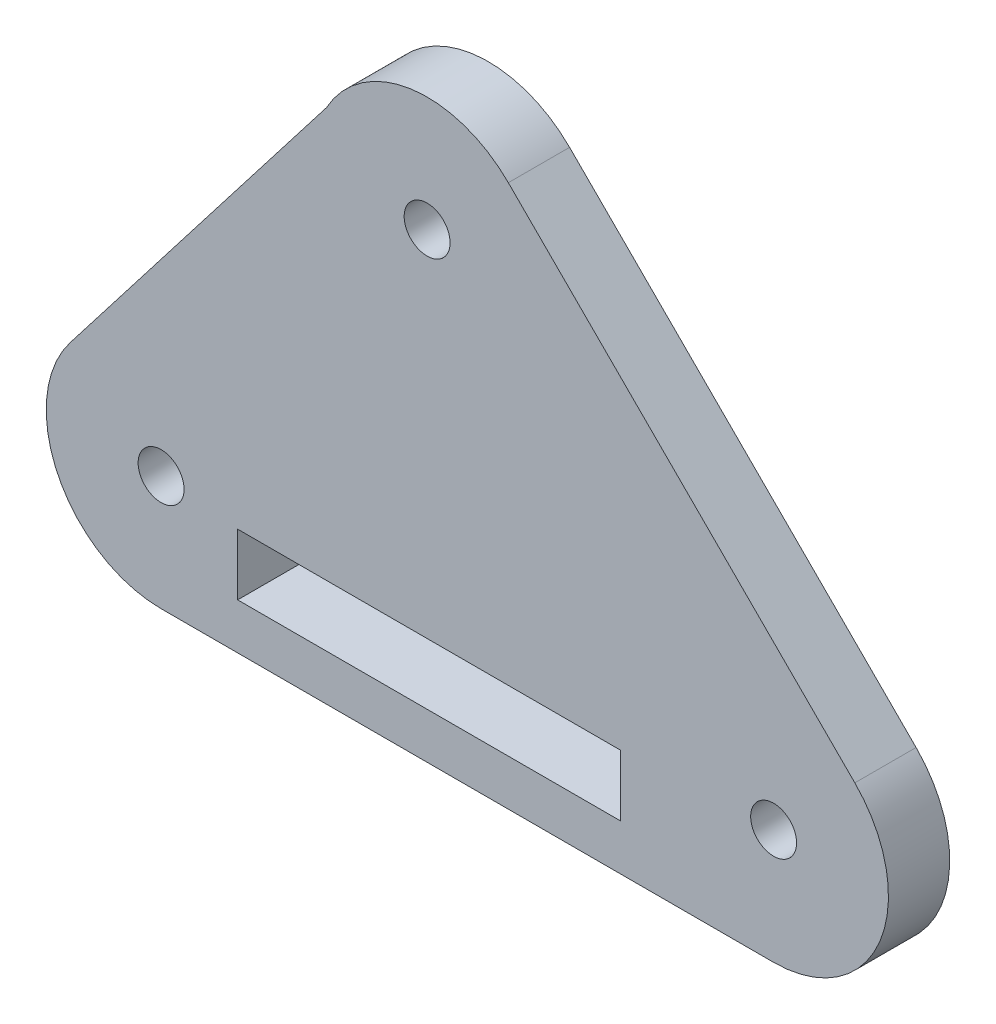
ISO-10303-21;
HEADER;
FILE_DESCRIPTION(('STEP AP214'),'2;1');
FILE_NAME('part.step','',(''),(''),'','','');
FILE_SCHEMA(('AUTOMOTIVE_DESIGN { 1 0 10303 214 1 1 1 1 }'));
ENDSEC;
DATA;
#1=APPLICATION_CONTEXT('core data for automotive mechanical design processes');
#2=APPLICATION_PROTOCOL_DEFINITION('international standard','automotive_design',2000,#1);
#3=PRODUCT_CONTEXT('',#1,'mechanical');
#4=PRODUCT('Part','Part','',(#3));
#5=PRODUCT_RELATED_PRODUCT_CATEGORY('part','',(#4));
#6=PRODUCT_DEFINITION_FORMATION('','',#4);
#7=PRODUCT_DEFINITION_CONTEXT('part definition',#1,'design');
#8=PRODUCT_DEFINITION('design','',#6,#7);
#9=PRODUCT_DEFINITION_SHAPE('','',#8);
#10=(LENGTH_UNIT() NAMED_UNIT(*) SI_UNIT(.MILLI.,.METRE.));
#11=(NAMED_UNIT(*) PLANE_ANGLE_UNIT() SI_UNIT($,.RADIAN.));
#12=(NAMED_UNIT(*) SI_UNIT($,.STERADIAN.) SOLID_ANGLE_UNIT());
#13=UNCERTAINTY_MEASURE_WITH_UNIT(LENGTH_MEASURE(1.E-05),#10,'distance_accuracy_value','');
#14=(GEOMETRIC_REPRESENTATION_CONTEXT(3) GLOBAL_UNCERTAINTY_ASSIGNED_CONTEXT((#13)) GLOBAL_UNIT_ASSIGNED_CONTEXT((#10,
#11,#12)) REPRESENTATION_CONTEXT('',''));
#15=CARTESIAN_POINT('',(0.,0.,0.));
#16=DIRECTION('',(0.,0.,1.));
#17=DIRECTION('',(1.,0.,0.));
#18=AXIS2_PLACEMENT_3D('',#15,#16,#17);
#19=CARTESIAN_POINT('',(0.,0.,4.));
#20=DIRECTION('',(0.,0.,1.));
#21=DIRECTION('',(1.,0.,0.));
#22=AXIS2_PLACEMENT_3D('',#19,#20,#21);
#23=PLANE('',#22);
#24=CARTESIAN_POINT('',(-22.6274169979697,22.6274169979694,4.));
#25=DIRECTION('',(0.,0.,1.));
#26=DIRECTION('',(1.,0.,0.));
#27=AXIS2_PLACEMENT_3D('',#24,#25,#26);
#28=CIRCLE('',#27,1.50000000000001);
#29=CARTESIAN_POINT('',(-21.1274169979696,22.6274169979694,4.));
#30=VERTEX_POINT('',#29);
#31=EDGE_CURVE('E148',#30,#30,#28,.T.);
#32=ORIENTED_EDGE('',*,*,#31,.F.);
#33=EDGE_LOOP('',(#32));
#34=FACE_BOUND('',#33,.T.);
#35=CARTESIAN_POINT('',(0.,0.,4.));
#36=DIRECTION('',(0.,0.,1.));
#37=DIRECTION('',(1.,0.,0.));
#38=AXIS2_PLACEMENT_3D('',#35,#36,#37);
#39=CIRCLE('',#38,1.5);
#40=CARTESIAN_POINT('',(1.5,0.,4.));
#41=VERTEX_POINT('',#40);
#42=EDGE_CURVE('E158',#41,#41,#39,.T.);
#43=ORIENTED_EDGE('',*,*,#42,.F.);
#44=EDGE_LOOP('',(#43));
#45=FACE_BOUND('',#44,.T.);
#46=DIRECTION('',(1.,0.,0.));
#47=VECTOR('',#46,1.);
#48=CARTESIAN_POINT('',(-40.,-7.5,4.));
#49=LINE('',#48,#47);
#50=CARTESIAN_POINT('',(-40.,-7.49999999999994,4.));
#51=VERTEX_POINT('',#50);
#52=CARTESIAN_POINT('',(0.,-7.5,4.));
#53=VERTEX_POINT('',#52);
#54=EDGE_CURVE('E164',#51,#53,#49,.T.);
#55=ORIENTED_EDGE('',*,*,#54,.T.);
#56=CARTESIAN_POINT('',(0.,0.,4.));
#57=DIRECTION('',(0.,0.,1.));
#58=DIRECTION('',(1.,0.,0.));
#59=AXIS2_PLACEMENT_3D('',#56,#57,#58);
#60=CIRCLE('',#59,7.49999999999994);
#61=CARTESIAN_POINT('',(5.30330085889905,5.30330085889907,4.));
#62=VERTEX_POINT('',#61);
#63=EDGE_CURVE('E166',#53,#62,#60,.T.);
#64=ORIENTED_EDGE('',*,*,#63,.T.);
#65=DIRECTION('',(-0.707106781186549,0.707106781186546,0.));
#66=VECTOR('',#65,1.);
#67=CARTESIAN_POINT('',(-17.3241161390706,27.9307178568685,4.));
#68=LINE('',#67,#66);
#69=CARTESIAN_POINT('',(-17.3241161390706,27.9307178568685,4.));
#70=VERTEX_POINT('',#69);
#71=EDGE_CURVE('E169',#62,#70,#68,.T.);
#72=ORIENTED_EDGE('',*,*,#71,.T.);
#73=CARTESIAN_POINT('',(-22.6274169979697,22.6274169979694,4.));
#74=DIRECTION('',(0.,0.,1.));
#75=DIRECTION('',(-1.,0.,0.));
#76=AXIS2_PLACEMENT_3D('',#73,#74,#75);
#77=CIRCLE('',#76,7.5);
#78=CARTESIAN_POINT('',(-29.2018159304156,26.2367491629348,4.));
#79=VERTEX_POINT('',#78);
#80=EDGE_CURVE('E171',#70,#79,#77,.T.);
#81=ORIENTED_EDGE('',*,*,#80,.T.);
#82=DIRECTION('',(-0.611506676870263,-0.791239271107727,0.));
#83=VECTOR('',#82,1.);
#84=CARTESIAN_POINT('',(-45.9342945333079,4.5863000765269,4.));
#85=LINE('',#84,#83);
#86=CARTESIAN_POINT('',(-45.9342945333079,4.5863000765269,4.));
#87=VERTEX_POINT('',#86);
#88=EDGE_CURVE('E173',#79,#87,#85,.T.);
#89=ORIENTED_EDGE('',*,*,#88,.T.);
#90=CARTESIAN_POINT('',(-40.,0.,4.));
#91=DIRECTION('',(0.,0.,1.));
#92=DIRECTION('',(-1.,0.,0.));
#93=AXIS2_PLACEMENT_3D('',#90,#91,#92);
#94=CIRCLE('',#93,7.49999999999994);
#95=EDGE_CURVE('E175',#87,#51,#94,.T.);
#96=ORIENTED_EDGE('',*,*,#95,.T.);
#97=EDGE_LOOP('',(#55,#64,#72,#81,#89,#96));
#98=FACE_BOUND('',#97,.T.);
#99=DIRECTION('',(1.,0.,0.));
#100=VECTOR('',#99,1.);
#101=CARTESIAN_POINT('',(-10.,-4.49999999999987,4.));
#102=LINE('',#101,#100);
#103=CARTESIAN_POINT('',(-35.,-4.49999999999988,4.));
#104=VERTEX_POINT('',#103);
#105=CARTESIAN_POINT('',(-10.,-4.49999999999987,4.));
#106=VERTEX_POINT('',#105);
#107=EDGE_CURVE('E127',#104,#106,#102,.T.);
#108=ORIENTED_EDGE('',*,*,#107,.F.);
#109=DIRECTION('',(0.,-1.,0.));
#110=VECTOR('',#109,1.);
#111=CARTESIAN_POINT('',(-35.,-4.49999999999988,4.));
#112=LINE('',#111,#110);
#113=CARTESIAN_POINT('',(-35.,-0.499999999999876,4.));
#114=VERTEX_POINT('',#113);
#115=EDGE_CURVE('E119',#114,#104,#112,.T.);
#116=ORIENTED_EDGE('',*,*,#115,.F.);
#117=DIRECTION('',(-1.,0.,0.));
#118=VECTOR('',#117,1.);
#119=CARTESIAN_POINT('',(-10.,-0.499999999999872,4.));
#120=LINE('',#119,#118);
#121=CARTESIAN_POINT('',(-10.,-0.499999999999872,4.));
#122=VERTEX_POINT('',#121);
#123=EDGE_CURVE('E142',#122,#114,#120,.T.);
#124=ORIENTED_EDGE('',*,*,#123,.F.);
#125=DIRECTION('',(0.,1.,0.));
#126=VECTOR('',#125,1.);
#127=CARTESIAN_POINT('',(-10.,-4.49999999999987,4.));
#128=LINE('',#127,#126);
#129=EDGE_CURVE('E140',#106,#122,#128,.T.);
#130=ORIENTED_EDGE('',*,*,#129,.F.);
#131=EDGE_LOOP('',(#108,#116,#124,#130));
#132=FACE_BOUND('',#131,.T.);
#133=CARTESIAN_POINT('',(-40.,0.,4.));
#134=DIRECTION('',(0.,0.,1.));
#135=DIRECTION('',(1.,0.,0.));
#136=AXIS2_PLACEMENT_3D('',#133,#134,#135);
#137=CIRCLE('',#136,1.5);
#138=CARTESIAN_POINT('',(-38.5,0.,4.));
#139=VERTEX_POINT('',#138);
#140=EDGE_CURVE('E276',#139,#139,#137,.T.);
#141=ORIENTED_EDGE('',*,*,#140,.F.);
#142=EDGE_LOOP('',(#141));
#143=FACE_BOUND('',#142,.T.);
#144=ADVANCED_FACE('F42',(#34,#45,#98,#132,#143),#23,.T.);
#145=CARTESIAN_POINT('',(0.,0.,0.));
#146=DIRECTION('',(0.,0.,1.));
#147=DIRECTION('',(1.,0.,0.));
#148=AXIS2_PLACEMENT_3D('',#145,#146,#147);
#149=PLANE('',#148);
#150=CARTESIAN_POINT('',(-22.6274169979697,22.6274169979694,0.));
#151=DIRECTION('',(0.,0.,1.));
#152=DIRECTION('',(1.,0.,0.));
#153=AXIS2_PLACEMENT_3D('',#150,#151,#152);
#154=CIRCLE('',#153,1.50000000000001);
#155=CARTESIAN_POINT('',(-21.1274169979696,22.6274169979694,0.));
#156=VERTEX_POINT('',#155);
#157=EDGE_CURVE('E282',#156,#156,#154,.T.);
#158=ORIENTED_EDGE('',*,*,#157,.T.);
#159=EDGE_LOOP('',(#158));
#160=FACE_BOUND('',#159,.T.);
#161=CARTESIAN_POINT('',(0.,0.,0.));
#162=DIRECTION('',(0.,0.,1.));
#163=DIRECTION('',(1.,0.,0.));
#164=AXIS2_PLACEMENT_3D('',#161,#162,#163);
#165=CIRCLE('',#164,1.5);
#166=CARTESIAN_POINT('',(1.5,0.,0.));
#167=VERTEX_POINT('',#166);
#168=EDGE_CURVE('E135',#167,#167,#165,.T.);
#169=ORIENTED_EDGE('',*,*,#168,.T.);
#170=EDGE_LOOP('',(#169));
#171=FACE_BOUND('',#170,.T.);
#172=DIRECTION('',(1.,0.,0.));
#173=VECTOR('',#172,1.);
#174=CARTESIAN_POINT('',(-22.6274169979696,-7.5,0.));
#175=LINE('',#174,#173);
#176=CARTESIAN_POINT('',(-40.,-7.49999999999994,0.));
#177=VERTEX_POINT('',#176);
#178=CARTESIAN_POINT('',(0.,-7.5,0.));
#179=VERTEX_POINT('',#178);
#180=EDGE_CURVE('E161',#177,#179,#175,.T.);
#181=ORIENTED_EDGE('',*,*,#180,.F.);
#182=CARTESIAN_POINT('',(-40.,0.,0.));
#183=DIRECTION('',(0.,0.,1.));
#184=DIRECTION('',(-1.,0.,0.));
#185=AXIS2_PLACEMENT_3D('',#182,#183,#184);
#186=CIRCLE('',#185,7.49999999999994);
#187=CARTESIAN_POINT('',(-45.9342945333079,4.5863000765269,0.));
#188=VERTEX_POINT('',#187);
#189=EDGE_CURVE('E167',#188,#177,#186,.T.);
#190=ORIENTED_EDGE('',*,*,#189,.F.);
#191=DIRECTION('',(-0.611506676870263,-0.791239271107727,0.));
#192=VECTOR('',#191,1.);
#193=CARTESIAN_POINT('',(-45.9342945333079,4.5863000765269,0.));
#194=LINE('',#193,#192);
#195=CARTESIAN_POINT('',(-29.2018159304156,26.2367491629348,0.));
#196=VERTEX_POINT('',#195);
#197=EDGE_CURVE('E185',#196,#188,#194,.T.);
#198=ORIENTED_EDGE('',*,*,#197,.F.);
#199=CARTESIAN_POINT('',(-22.6274169979697,22.6274169979694,0.));
#200=DIRECTION('',(0.,0.,1.));
#201=DIRECTION('',(-1.,0.,0.));
#202=AXIS2_PLACEMENT_3D('',#199,#200,#201);
#203=CIRCLE('',#202,7.5);
#204=CARTESIAN_POINT('',(-17.3241161390706,27.9307178568685,0.));
#205=VERTEX_POINT('',#204);
#206=EDGE_CURVE('E183',#205,#196,#203,.T.);
#207=ORIENTED_EDGE('',*,*,#206,.F.);
#208=DIRECTION('',(-0.707106781186549,0.707106781186546,0.));
#209=VECTOR('',#208,1.);
#210=CARTESIAN_POINT('',(-17.3241161390706,27.9307178568685,0.));
#211=LINE('',#210,#209);
#212=CARTESIAN_POINT('',(5.30330085889905,5.30330085889907,0.));
#213=VERTEX_POINT('',#212);
#214=EDGE_CURVE('E181',#213,#205,#211,.T.);
#215=ORIENTED_EDGE('',*,*,#214,.F.);
#216=CARTESIAN_POINT('',(0.,0.,0.));
#217=DIRECTION('',(0.,0.,1.));
#218=DIRECTION('',(1.,0.,0.));
#219=AXIS2_PLACEMENT_3D('',#216,#217,#218);
#220=CIRCLE('',#219,7.49999999999994);
#221=EDGE_CURVE('E179',#179,#213,#220,.T.);
#222=ORIENTED_EDGE('',*,*,#221,.F.);
#223=EDGE_LOOP('',(#181,#190,#198,#207,#215,#222));
#224=FACE_BOUND('',#223,.T.);
#225=DIRECTION('',(0.,-1.,0.));
#226=VECTOR('',#225,1.);
#227=CARTESIAN_POINT('',(-35.,-4.49999999999988,0.));
#228=LINE('',#227,#226);
#229=CARTESIAN_POINT('',(-35.,-0.499999999999876,0.));
#230=VERTEX_POINT('',#229);
#231=CARTESIAN_POINT('',(-35.,-4.49999999999988,0.));
#232=VERTEX_POINT('',#231);
#233=EDGE_CURVE('E65',#230,#232,#228,.T.);
#234=ORIENTED_EDGE('',*,*,#233,.T.);
#235=DIRECTION('',(1.,0.,0.));
#236=VECTOR('',#235,1.);
#237=CARTESIAN_POINT('',(-10.,-4.49999999999987,0.));
#238=LINE('',#237,#236);
#239=CARTESIAN_POINT('',(-10.,-4.49999999999987,0.));
#240=VERTEX_POINT('',#239);
#241=EDGE_CURVE('E134',#232,#240,#238,.T.);
#242=ORIENTED_EDGE('',*,*,#241,.T.);
#243=DIRECTION('',(0.,1.,0.));
#244=VECTOR('',#243,1.);
#245=CARTESIAN_POINT('',(-10.,-4.49999999999987,0.));
#246=LINE('',#245,#244);
#247=CARTESIAN_POINT('',(-10.,-0.499999999999872,0.));
#248=VERTEX_POINT('',#247);
#249=EDGE_CURVE('E150',#240,#248,#246,.T.);
#250=ORIENTED_EDGE('',*,*,#249,.T.);
#251=DIRECTION('',(-1.,0.,0.));
#252=VECTOR('',#251,1.);
#253=CARTESIAN_POINT('',(-10.,-0.499999999999872,0.));
#254=LINE('',#253,#252);
#255=EDGE_CURVE('E128',#248,#230,#254,.T.);
#256=ORIENTED_EDGE('',*,*,#255,.T.);
#257=EDGE_LOOP('',(#234,#242,#250,#256));
#258=FACE_BOUND('',#257,.T.);
#259=CARTESIAN_POINT('',(-40.,0.,0.));
#260=DIRECTION('',(0.,0.,1.));
#261=DIRECTION('',(1.,0.,0.));
#262=AXIS2_PLACEMENT_3D('',#259,#260,#261);
#263=CIRCLE('',#262,1.5);
#264=CARTESIAN_POINT('',(-38.5,0.,0.));
#265=VERTEX_POINT('',#264);
#266=EDGE_CURVE('E279',#265,#265,#263,.T.);
#267=ORIENTED_EDGE('',*,*,#266,.T.);
#268=EDGE_LOOP('',(#267));
#269=FACE_BOUND('',#268,.T.);
#270=ADVANCED_FACE('F211',(#160,#171,#224,#258,#269),#149,.F.);
#271=CARTESIAN_POINT('',(-22.6274169979696,-7.5,4.));
#272=DIRECTION('',(0.,1.,0.));
#273=DIRECTION('',(-1.,0.,0.));
#274=AXIS2_PLACEMENT_3D('',#271,#272,#273);
#275=PLANE('',#274);
#276=ORIENTED_EDGE('',*,*,#180,.T.);
#277=DIRECTION('',(0.,0.,-1.));
#278=VECTOR('',#277,1.);
#279=CARTESIAN_POINT('',(0.,-7.5,4.));
#280=LINE('',#279,#278);
#281=EDGE_CURVE('E13',#53,#179,#280,.T.);
#282=ORIENTED_EDGE('',*,*,#281,.F.);
#283=ORIENTED_EDGE('',*,*,#54,.F.);
#284=DIRECTION('',(0.,0.,-1.));
#285=VECTOR('',#284,1.);
#286=CARTESIAN_POINT('',(-40.,-7.49999999999994,4.));
#287=LINE('',#286,#285);
#288=EDGE_CURVE('E177',#51,#177,#287,.T.);
#289=ORIENTED_EDGE('',*,*,#288,.T.);
#290=EDGE_LOOP('',(#276,#282,#283,#289));
#291=FACE_BOUND('',#290,.T.);
#292=ADVANCED_FACE('F44',(#291),#275,.F.);
#293=CARTESIAN_POINT('',(0.,0.,4.));
#294=DIRECTION('',(0.,0.,-1.));
#295=DIRECTION('',(-1.,0.,0.));
#296=AXIS2_PLACEMENT_3D('',#293,#294,#295);
#297=CYLINDRICAL_SURFACE('',#296,7.49999999999994);
#298=ORIENTED_EDGE('',*,*,#221,.T.);
#299=DIRECTION('',(0.,0.,-1.));
#300=VECTOR('',#299,1.);
#301=CARTESIAN_POINT('',(5.30330085889905,5.30330085889907,4.));
#302=LINE('',#301,#300);
#303=EDGE_CURVE('E50',#62,#213,#302,.T.);
#304=ORIENTED_EDGE('',*,*,#303,.F.);
#305=ORIENTED_EDGE('',*,*,#63,.F.);
#306=ORIENTED_EDGE('',*,*,#281,.T.);
#307=EDGE_LOOP('',(#298,#304,#305,#306));
#308=FACE_BOUND('',#307,.T.);
#309=ADVANCED_FACE('F228',(#308),#297,.T.);
#310=CARTESIAN_POINT('',(-17.3241161390706,27.9307178568685,4.));
#311=DIRECTION('',(-0.707106781186546,-0.707106781186549,0.));
#312=DIRECTION('',(0.707106781186549,-0.707106781186546,0.));
#313=AXIS2_PLACEMENT_3D('',#310,#311,#312);
#314=PLANE('',#313);
#315=ORIENTED_EDGE('',*,*,#214,.T.);
#316=DIRECTION('',(0.,0.,-1.));
#317=VECTOR('',#316,1.);
#318=CARTESIAN_POINT('',(-17.3241161390706,27.9307178568685,4.));
#319=LINE('',#318,#317);
#320=EDGE_CURVE('E197',#70,#205,#319,.T.);
#321=ORIENTED_EDGE('',*,*,#320,.F.);
#322=ORIENTED_EDGE('',*,*,#71,.F.);
#323=ORIENTED_EDGE('',*,*,#303,.T.);
#324=EDGE_LOOP('',(#315,#321,#322,#323));
#325=FACE_BOUND('',#324,.T.);
#326=ADVANCED_FACE('F204',(#325),#314,.F.);
#327=CARTESIAN_POINT('',(-22.6274169979697,22.6274169979694,4.));
#328=DIRECTION('',(0.,0.,-1.));
#329=DIRECTION('',(-1.,0.,0.));
#330=AXIS2_PLACEMENT_3D('',#327,#328,#329);
#331=CYLINDRICAL_SURFACE('',#330,7.5);
#332=ORIENTED_EDGE('',*,*,#206,.T.);
#333=DIRECTION('',(0.,0.,-1.));
#334=VECTOR('',#333,1.);
#335=CARTESIAN_POINT('',(-29.2018159304156,26.2367491629348,4.));
#336=LINE('',#335,#334);
#337=EDGE_CURVE('E194',#79,#196,#336,.T.);
#338=ORIENTED_EDGE('',*,*,#337,.F.);
#339=ORIENTED_EDGE('',*,*,#80,.F.);
#340=ORIENTED_EDGE('',*,*,#320,.T.);
#341=EDGE_LOOP('',(#332,#338,#339,#340));
#342=FACE_BOUND('',#341,.T.);
#343=ADVANCED_FACE('F217',(#342),#331,.T.);
#344=CARTESIAN_POINT('',(-45.9342945333079,4.5863000765269,4.));
#345=DIRECTION('',(0.791239271107727,-0.611506676870263,0.));
#346=DIRECTION('',(0.611506676870263,0.791239271107727,0.));
#347=AXIS2_PLACEMENT_3D('',#344,#345,#346);
#348=PLANE('',#347);
#349=ORIENTED_EDGE('',*,*,#197,.T.);
#350=DIRECTION('',(0.,0.,-1.));
#351=VECTOR('',#350,1.);
#352=CARTESIAN_POINT('',(-45.9342945333079,4.5863000765269,4.));
#353=LINE('',#352,#351);
#354=EDGE_CURVE('E191',#87,#188,#353,.T.);
#355=ORIENTED_EDGE('',*,*,#354,.F.);
#356=ORIENTED_EDGE('',*,*,#88,.F.);
#357=ORIENTED_EDGE('',*,*,#337,.T.);
#358=EDGE_LOOP('',(#349,#355,#356,#357));
#359=FACE_BOUND('',#358,.T.);
#360=ADVANCED_FACE('F221',(#359),#348,.F.);
#361=CARTESIAN_POINT('',(-40.,0.,4.));
#362=DIRECTION('',(0.,0.,-1.));
#363=DIRECTION('',(-1.,0.,0.));
#364=AXIS2_PLACEMENT_3D('',#361,#362,#363);
#365=CYLINDRICAL_SURFACE('',#364,7.49999999999994);
#366=ORIENTED_EDGE('',*,*,#189,.T.);
#367=ORIENTED_EDGE('',*,*,#288,.F.);
#368=ORIENTED_EDGE('',*,*,#95,.F.);
#369=ORIENTED_EDGE('',*,*,#354,.T.);
#370=EDGE_LOOP('',(#366,#367,#368,#369));
#371=FACE_BOUND('',#370,.T.);
#372=ADVANCED_FACE('F231',(#371),#365,.T.);
#373=CARTESIAN_POINT('',(0.,0.,4.));
#374=DIRECTION('',(0.,0.,-1.));
#375=DIRECTION('',(-1.,0.,0.));
#376=AXIS2_PLACEMENT_3D('',#373,#374,#375);
#377=CYLINDRICAL_SURFACE('',#376,1.5);
#378=ORIENTED_EDGE('',*,*,#42,.T.);
#379=EDGE_LOOP('',(#378));
#380=FACE_BOUND('',#379,.T.);
#381=ORIENTED_EDGE('',*,*,#168,.F.);
#382=EDGE_LOOP('',(#381));
#383=FACE_BOUND('',#382,.T.);
#384=ADVANCED_FACE('F233',(#380,#383),#377,.F.);
#385=CARTESIAN_POINT('',(-35.,-4.49999999999988,4.));
#386=DIRECTION('',(1.,0.,0.));
#387=DIRECTION('',(0.,1.,0.));
#388=AXIS2_PLACEMENT_3D('',#385,#386,#387);
#389=PLANE('',#388);
#390=ORIENTED_EDGE('',*,*,#233,.F.);
#391=DIRECTION('',(0.,0.,-1.));
#392=VECTOR('',#391,1.);
#393=CARTESIAN_POINT('',(-35.,-0.499999999999876,4.));
#394=LINE('',#393,#392);
#395=EDGE_CURVE('E123',#114,#230,#394,.T.);
#396=ORIENTED_EDGE('',*,*,#395,.F.);
#397=ORIENTED_EDGE('',*,*,#115,.T.);
#398=DIRECTION('',(0.,0.,-1.));
#399=VECTOR('',#398,1.);
#400=CARTESIAN_POINT('',(-35.,-4.49999999999988,4.));
#401=LINE('',#400,#399);
#402=EDGE_CURVE('E122',#104,#232,#401,.T.);
#403=ORIENTED_EDGE('',*,*,#402,.T.);
#404=EDGE_LOOP('',(#390,#396,#397,#403));
#405=FACE_BOUND('',#404,.T.);
#406=ADVANCED_FACE('F121',(#405),#389,.T.);
#407=CARTESIAN_POINT('',(-10.,-4.49999999999987,4.));
#408=DIRECTION('',(0.,1.,0.));
#409=DIRECTION('',(-1.,0.,0.));
#410=AXIS2_PLACEMENT_3D('',#407,#408,#409);
#411=PLANE('',#410);
#412=ORIENTED_EDGE('',*,*,#241,.F.);
#413=ORIENTED_EDGE('',*,*,#402,.F.);
#414=ORIENTED_EDGE('',*,*,#107,.T.);
#415=DIRECTION('',(0.,0.,-1.));
#416=VECTOR('',#415,1.);
#417=CARTESIAN_POINT('',(-10.,-4.49999999999987,4.));
#418=LINE('',#417,#416);
#419=EDGE_CURVE('E136',#106,#240,#418,.T.);
#420=ORIENTED_EDGE('',*,*,#419,.T.);
#421=EDGE_LOOP('',(#412,#413,#414,#420));
#422=FACE_BOUND('',#421,.T.);
#423=ADVANCED_FACE('F131',(#422),#411,.T.);
#424=CARTESIAN_POINT('',(-10.,-4.49999999999987,4.));
#425=DIRECTION('',(-1.,0.,0.));
#426=DIRECTION('',(0.,0.,1.));
#427=AXIS2_PLACEMENT_3D('',#424,#425,#426);
#428=PLANE('',#427);
#429=ORIENTED_EDGE('',*,*,#249,.F.);
#430=ORIENTED_EDGE('',*,*,#419,.F.);
#431=ORIENTED_EDGE('',*,*,#129,.T.);
#432=DIRECTION('',(0.,0.,-1.));
#433=VECTOR('',#432,1.);
#434=CARTESIAN_POINT('',(-10.,-0.499999999999872,4.));
#435=LINE('',#434,#433);
#436=EDGE_CURVE('E57',#122,#248,#435,.T.);
#437=ORIENTED_EDGE('',*,*,#436,.T.);
#438=EDGE_LOOP('',(#429,#430,#431,#437));
#439=FACE_BOUND('',#438,.T.);
#440=ADVANCED_FACE('F257',(#439),#428,.T.);
#441=CARTESIAN_POINT('',(-10.,-0.499999999999872,4.));
#442=DIRECTION('',(0.,-1.,0.));
#443=DIRECTION('',(1.,0.,0.));
#444=AXIS2_PLACEMENT_3D('',#441,#442,#443);
#445=PLANE('',#444);
#446=ORIENTED_EDGE('',*,*,#255,.F.);
#447=ORIENTED_EDGE('',*,*,#436,.F.);
#448=ORIENTED_EDGE('',*,*,#123,.T.);
#449=ORIENTED_EDGE('',*,*,#395,.T.);
#450=EDGE_LOOP('',(#446,#447,#448,#449));
#451=FACE_BOUND('',#450,.T.);
#452=ADVANCED_FACE('F260',(#451),#445,.T.);
#453=CARTESIAN_POINT('',(-22.6274169979697,22.6274169979694,4.));
#454=DIRECTION('',(0.,0.,-1.));
#455=DIRECTION('',(-1.,0.,0.));
#456=AXIS2_PLACEMENT_3D('',#453,#454,#455);
#457=CYLINDRICAL_SURFACE('',#456,1.50000000000001);
#458=ORIENTED_EDGE('',*,*,#31,.T.);
#459=EDGE_LOOP('',(#458));
#460=FACE_BOUND('',#459,.T.);
#461=ORIENTED_EDGE('',*,*,#157,.F.);
#462=EDGE_LOOP('',(#461));
#463=FACE_BOUND('',#462,.T.);
#464=ADVANCED_FACE('F264',(#460,#463),#457,.F.);
#465=CARTESIAN_POINT('',(-40.,0.,4.));
#466=DIRECTION('',(0.,0.,-1.));
#467=DIRECTION('',(-1.,0.,0.));
#468=AXIS2_PLACEMENT_3D('',#465,#466,#467);
#469=CYLINDRICAL_SURFACE('',#468,1.5);
#470=ORIENTED_EDGE('',*,*,#140,.T.);
#471=EDGE_LOOP('',(#470));
#472=FACE_BOUND('',#471,.T.);
#473=ORIENTED_EDGE('',*,*,#266,.F.);
#474=EDGE_LOOP('',(#473));
#475=FACE_BOUND('',#474,.T.);
#476=ADVANCED_FACE('F267',(#472,#475),#469,.F.);
#477=CLOSED_SHELL('',(#144,#270,#292,#309,#326,#343,#360,#372,#384,#406,#423,#440,#452,#464,#476));
#478=MANIFOLD_SOLID_BREP('B2',#477);
#479=ADVANCED_BREP_SHAPE_REPRESENTATION('',(#18,#478),#14);
#480=SHAPE_DEFINITION_REPRESENTATION(#9,#479);
ENDSEC;
END-ISO-10303-21;
